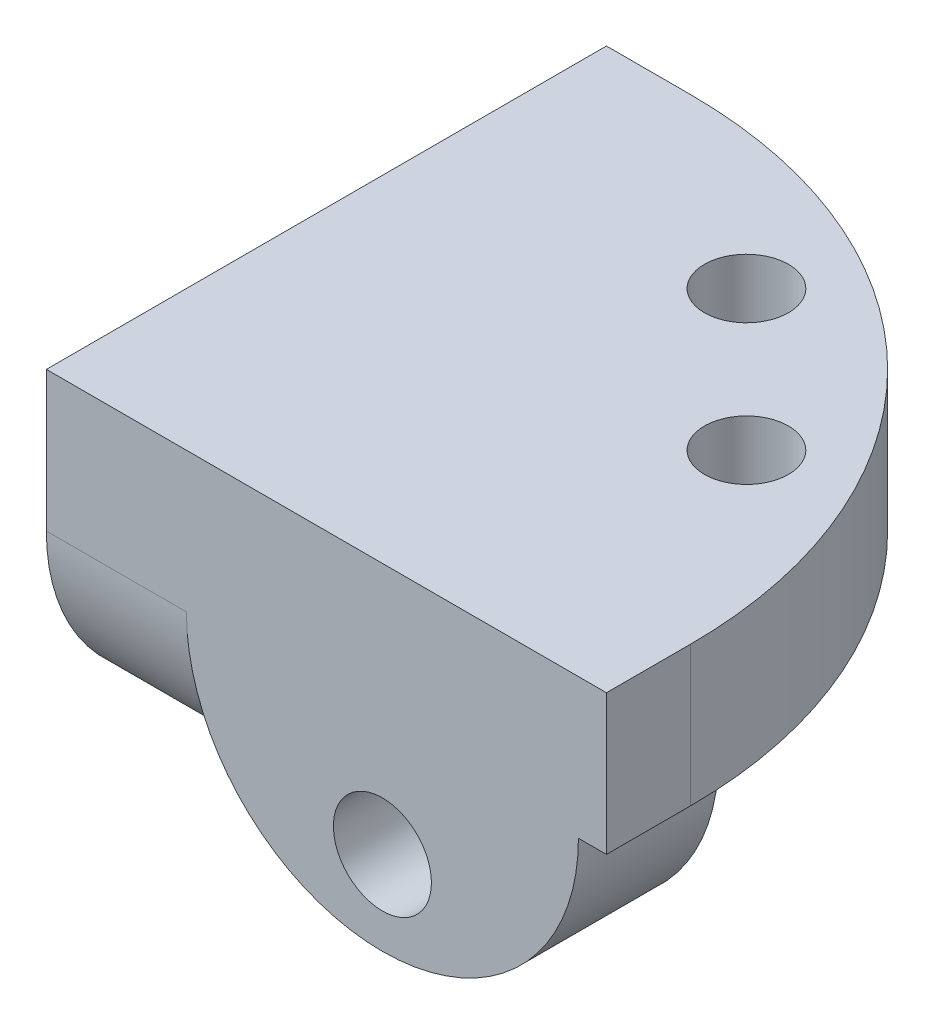
ISO-10303-21;
HEADER;
FILE_DESCRIPTION(('STEP AP214'),'2;1');
FILE_NAME('part.step','',(''),(''),'','','');
FILE_SCHEMA(('AUTOMOTIVE_DESIGN { 1 0 10303 214 1 1 1 1 }'));
ENDSEC;
DATA;
#1=APPLICATION_CONTEXT('core data for automotive mechanical design processes');
#2=APPLICATION_PROTOCOL_DEFINITION('international standard','automotive_design',2000,#1);
#3=PRODUCT_CONTEXT('',#1,'mechanical');
#4=PRODUCT('Part','Part','',(#3));
#5=PRODUCT_RELATED_PRODUCT_CATEGORY('part','',(#4));
#6=PRODUCT_DEFINITION_FORMATION('','',#4);
#7=PRODUCT_DEFINITION_CONTEXT('part definition',#1,'design');
#8=PRODUCT_DEFINITION('design','',#6,#7);
#9=PRODUCT_DEFINITION_SHAPE('','',#8);
#10=(LENGTH_UNIT() NAMED_UNIT(*) SI_UNIT(.MILLI.,.METRE.));
#11=(NAMED_UNIT(*) PLANE_ANGLE_UNIT() SI_UNIT($,.RADIAN.));
#12=(NAMED_UNIT(*) SI_UNIT($,.STERADIAN.) SOLID_ANGLE_UNIT());
#13=UNCERTAINTY_MEASURE_WITH_UNIT(LENGTH_MEASURE(1.E-05),#10,'distance_accuracy_value','');
#14=(GEOMETRIC_REPRESENTATION_CONTEXT(3) GLOBAL_UNCERTAINTY_ASSIGNED_CONTEXT((#13)) GLOBAL_UNIT_ASSIGNED_CONTEXT((#10,
#11,#12)) REPRESENTATION_CONTEXT('',''));
#15=CARTESIAN_POINT('',(0.,0.,0.));
#16=DIRECTION('',(0.,0.,1.));
#17=DIRECTION('',(1.,0.,0.));
#18=AXIS2_PLACEMENT_3D('',#15,#16,#17);
#19=CARTESIAN_POINT('',(0.,5.,0.));
#20=DIRECTION('',(0.,-1.,0.));
#21=DIRECTION('',(0.,0.,-1.));
#22=AXIS2_PLACEMENT_3D('',#19,#20,#21);
#23=PLANE('',#22);
#24=DIRECTION('',(0.,0.,-1.));
#25=VECTOR('',#24,1.);
#26=CARTESIAN_POINT('',(20.,5.,0.));
#27=LINE('',#26,#25);
#28=CARTESIAN_POINT('',(20.,5.,0.));
#29=VERTEX_POINT('',#28);
#30=CARTESIAN_POINT('',(20.,5.,-3.));
#31=VERTEX_POINT('',#30);
#32=EDGE_CURVE('E159',#29,#31,#27,.T.);
#33=ORIENTED_EDGE('',*,*,#32,.T.);
#34=CARTESIAN_POINT('',(3.,5.,-3.));
#35=DIRECTION('',(0.,-1.,0.));
#36=DIRECTION('',(0.,0.,-1.));
#37=AXIS2_PLACEMENT_3D('',#34,#35,#36);
#38=CIRCLE('',#37,17.);
#39=CARTESIAN_POINT('',(3.,5.,-20.));
#40=VERTEX_POINT('',#39);
#41=EDGE_CURVE('E11',#31,#40,#38,.F.);
#42=ORIENTED_EDGE('',*,*,#41,.T.);
#43=DIRECTION('',(-1.,0.,0.));
#44=VECTOR('',#43,1.);
#45=CARTESIAN_POINT('',(0.,5.,-20.));
#46=LINE('',#45,#44);
#47=CARTESIAN_POINT('',(0.,5.,-20.));
#48=VERTEX_POINT('',#47);
#49=EDGE_CURVE('E161',#40,#48,#46,.T.);
#50=ORIENTED_EDGE('',*,*,#49,.T.);
#51=DIRECTION('',(0.,0.,1.));
#52=VECTOR('',#51,1.);
#53=CARTESIAN_POINT('',(0.,5.,0.));
#54=LINE('',#53,#52);
#55=CARTESIAN_POINT('',(0.,5.,0.));
#56=VERTEX_POINT('',#55);
#57=EDGE_CURVE('E153',#48,#56,#54,.T.);
#58=ORIENTED_EDGE('',*,*,#57,.T.);
#59=DIRECTION('',(1.,0.,0.));
#60=VECTOR('',#59,1.);
#61=CARTESIAN_POINT('',(0.,5.,0.));
#62=LINE('',#61,#60);
#63=EDGE_CURVE('E156',#56,#29,#62,.T.);
#64=ORIENTED_EDGE('',*,*,#63,.T.);
#65=EDGE_LOOP('',(#33,#42,#50,#58,#64));
#66=FACE_BOUND('',#65,.T.);
#67=CARTESIAN_POINT('',(10.,5.,-15.));
#68=DIRECTION('',(0.,1.,0.));
#69=DIRECTION('',(0.,0.,1.));
#70=AXIS2_PLACEMENT_3D('',#67,#68,#69);
#71=CIRCLE('',#70,1.5);
#72=CARTESIAN_POINT('',(10.,5.,-13.5));
#73=VERTEX_POINT('',#72);
#74=EDGE_CURVE('E147',#73,#73,#71,.T.);
#75=ORIENTED_EDGE('',*,*,#74,.F.);
#76=EDGE_LOOP('',(#75));
#77=FACE_BOUND('',#76,.T.);
#78=CARTESIAN_POINT('',(15.,5.,-10.));
#79=DIRECTION('',(0.,1.,0.));
#80=DIRECTION('',(0.,0.,1.));
#81=AXIS2_PLACEMENT_3D('',#78,#79,#80);
#82=CIRCLE('',#81,1.5);
#83=CARTESIAN_POINT('',(15.,5.,-8.5));
#84=VERTEX_POINT('',#83);
#85=EDGE_CURVE('E138',#84,#84,#82,.T.);
#86=ORIENTED_EDGE('',*,*,#85,.F.);
#87=EDGE_LOOP('',(#86));
#88=FACE_BOUND('',#87,.T.);
#89=ADVANCED_FACE('F34',(#66,#77,#88),#23,.F.);
#90=CARTESIAN_POINT('',(0.,0.,0.));
#91=DIRECTION('',(0.,-1.,0.));
#92=DIRECTION('',(0.,0.,-1.));
#93=AXIS2_PLACEMENT_3D('',#90,#91,#92);
#94=PLANE('',#93);
#95=DIRECTION('',(-1.,0.,0.));
#96=VECTOR('',#95,1.);
#97=CARTESIAN_POINT('',(0.,0.,-20.));
#98=LINE('',#97,#96);
#99=CARTESIAN_POINT('',(3.,0.,-20.));
#100=VERTEX_POINT('',#99);
#101=CARTESIAN_POINT('',(0.,0.,-20.));
#102=VERTEX_POINT('',#101);
#103=EDGE_CURVE('E157',#100,#102,#98,.T.);
#104=ORIENTED_EDGE('',*,*,#103,.F.);
#105=CARTESIAN_POINT('',(3.,0.,-3.));
#106=DIRECTION('',(0.,-1.,0.));
#107=DIRECTION('',(0.,0.,-1.));
#108=AXIS2_PLACEMENT_3D('',#105,#106,#107);
#109=CIRCLE('',#108,17.);
#110=CARTESIAN_POINT('',(20.,0.,-3.));
#111=VERTEX_POINT('',#110);
#112=EDGE_CURVE('E56',#100,#111,#109,.T.);
#113=ORIENTED_EDGE('',*,*,#112,.T.);
#114=DIRECTION('',(0.,0.,-1.));
#115=VECTOR('',#114,1.);
#116=CARTESIAN_POINT('',(20.,0.,0.));
#117=LINE('',#116,#115);
#118=CARTESIAN_POINT('',(20.,0.,0.));
#119=VERTEX_POINT('',#118);
#120=EDGE_CURVE('E110',#119,#111,#117,.T.);
#121=ORIENTED_EDGE('',*,*,#120,.F.);
#122=DIRECTION('',(1.,0.,0.));
#123=VECTOR('',#122,1.);
#124=CARTESIAN_POINT('',(0.,0.,0.));
#125=LINE('',#124,#123);
#126=CARTESIAN_POINT('',(19.,0.,0.));
#127=VERTEX_POINT('',#126);
#128=EDGE_CURVE('E111',#127,#119,#125,.T.);
#129=ORIENTED_EDGE('',*,*,#128,.F.);
#130=DIRECTION('',(0.,0.,1.));
#131=VECTOR('',#130,1.);
#132=CARTESIAN_POINT('',(19.,0.,-5.));
#133=LINE('',#132,#131);
#134=CARTESIAN_POINT('',(19.,0.,-5.));
#135=VERTEX_POINT('',#134);
#136=EDGE_CURVE('E119',#135,#127,#133,.T.);
#137=ORIENTED_EDGE('',*,*,#136,.F.);
#138=DIRECTION('',(-1.,0.,0.));
#139=VECTOR('',#138,1.);
#140=CARTESIAN_POINT('',(19.,0.,-5.));
#141=LINE('',#140,#139);
#142=CARTESIAN_POINT('',(5.,0.,-5.));
#143=VERTEX_POINT('',#142);
#144=EDGE_CURVE('E140',#135,#143,#141,.T.);
#145=ORIENTED_EDGE('',*,*,#144,.T.);
#146=DIRECTION('',(0.,0.,-1.));
#147=VECTOR('',#146,1.);
#148=CARTESIAN_POINT('',(5.,0.,0.));
#149=LINE('',#148,#147);
#150=CARTESIAN_POINT('',(5.,0.,-14.));
#151=VERTEX_POINT('',#150);
#152=EDGE_CURVE('E131',#143,#151,#149,.T.);
#153=ORIENTED_EDGE('',*,*,#152,.T.);
#154=DIRECTION('',(-1.,0.,0.));
#155=VECTOR('',#154,1.);
#156=CARTESIAN_POINT('',(5.,0.,-14.));
#157=LINE('',#156,#155);
#158=CARTESIAN_POINT('',(0.,0.,-14.));
#159=VERTEX_POINT('',#158);
#160=EDGE_CURVE('E128',#151,#159,#157,.T.);
#161=ORIENTED_EDGE('',*,*,#160,.T.);
#162=DIRECTION('',(0.,0.,1.));
#163=VECTOR('',#162,1.);
#164=CARTESIAN_POINT('',(0.,0.,0.));
#165=LINE('',#164,#163);
#166=EDGE_CURVE('E150',#102,#159,#165,.T.);
#167=ORIENTED_EDGE('',*,*,#166,.F.);
#168=EDGE_LOOP('',(#104,#113,#121,#129,#137,#145,#153,#161,#167));
#169=FACE_BOUND('',#168,.T.);
#170=CARTESIAN_POINT('',(10.,0.,-15.));
#171=DIRECTION('',(0.,1.,0.));
#172=DIRECTION('',(0.,0.,1.));
#173=AXIS2_PLACEMENT_3D('',#170,#171,#172);
#174=CIRCLE('',#173,1.5);
#175=CARTESIAN_POINT('',(10.,0.,-13.5));
#176=VERTEX_POINT('',#175);
#177=EDGE_CURVE('E145',#176,#176,#174,.T.);
#178=ORIENTED_EDGE('',*,*,#177,.T.);
#179=EDGE_LOOP('',(#178));
#180=FACE_BOUND('',#179,.T.);
#181=CARTESIAN_POINT('',(15.,0.,-10.));
#182=DIRECTION('',(0.,1.,0.));
#183=DIRECTION('',(0.,0.,1.));
#184=AXIS2_PLACEMENT_3D('',#181,#182,#183);
#185=CIRCLE('',#184,1.5);
#186=CARTESIAN_POINT('',(15.,0.,-8.5));
#187=VERTEX_POINT('',#186);
#188=EDGE_CURVE('E135',#187,#187,#185,.T.);
#189=ORIENTED_EDGE('',*,*,#188,.T.);
#190=EDGE_LOOP('',(#189));
#191=FACE_BOUND('',#190,.T.);
#192=ADVANCED_FACE('F185',(#169,#180,#191),#94,.T.);
#193=CARTESIAN_POINT('',(0.,5.,0.));
#194=DIRECTION('',(1.,0.,0.));
#195=DIRECTION('',(0.,0.,-1.));
#196=AXIS2_PLACEMENT_3D('',#193,#194,#195);
#197=PLANE('',#196);
#198=ORIENTED_EDGE('',*,*,#166,.T.);
#199=CARTESIAN_POINT('',(0.,0.,-7.));
#200=DIRECTION('',(-1.,0.,0.));
#201=DIRECTION('',(0.,0.,-1.));
#202=AXIS2_PLACEMENT_3D('',#199,#200,#201);
#203=CIRCLE('',#202,7.);
#204=CARTESIAN_POINT('',(0.,0.,0.));
#205=VERTEX_POINT('',#204);
#206=EDGE_CURVE('E132',#159,#205,#203,.T.);
#207=ORIENTED_EDGE('',*,*,#206,.T.);
#208=DIRECTION('',(0.,-1.,0.));
#209=VECTOR('',#208,1.);
#210=CARTESIAN_POINT('',(0.,5.,0.));
#211=LINE('',#210,#209);
#212=EDGE_CURVE('E105',#56,#205,#211,.T.);
#213=ORIENTED_EDGE('',*,*,#212,.F.);
#214=ORIENTED_EDGE('',*,*,#57,.F.);
#215=DIRECTION('',(0.,-1.,0.));
#216=VECTOR('',#215,1.);
#217=CARTESIAN_POINT('',(0.,5.,-20.));
#218=LINE('',#217,#216);
#219=EDGE_CURVE('E163',#48,#102,#218,.T.);
#220=ORIENTED_EDGE('',*,*,#219,.T.);
#221=EDGE_LOOP('',(#198,#207,#213,#214,#220));
#222=FACE_BOUND('',#221,.T.);
#223=CARTESIAN_POINT('',(0.,-4.,-7.));
#224=DIRECTION('',(-1.,0.,0.));
#225=DIRECTION('',(0.,0.,1.));
#226=AXIS2_PLACEMENT_3D('',#223,#224,#225);
#227=CIRCLE('',#226,1.75);
#228=CARTESIAN_POINT('',(0.,-4.,-5.25));
#229=VERTEX_POINT('',#228);
#230=EDGE_CURVE('E194',#229,#229,#227,.T.);
#231=ORIENTED_EDGE('',*,*,#230,.F.);
#232=EDGE_LOOP('',(#231));
#233=FACE_BOUND('',#232,.T.);
#234=ADVANCED_FACE('F188',(#222,#233),#197,.F.);
#235=CARTESIAN_POINT('',(0.,5.,0.));
#236=DIRECTION('',(0.,0.,-1.));
#237=DIRECTION('',(-1.,0.,0.));
#238=AXIS2_PLACEMENT_3D('',#235,#236,#237);
#239=PLANE('',#238);
#240=CARTESIAN_POINT('',(5.,0.,0.));
#241=VERTEX_POINT('',#240);
#242=EDGE_CURVE('E98',#205,#241,#125,.T.);
#243=ORIENTED_EDGE('',*,*,#242,.T.);
#244=CARTESIAN_POINT('',(12.,0.,0.));
#245=DIRECTION('',(0.,0.,1.));
#246=DIRECTION('',(1.,0.,0.));
#247=AXIS2_PLACEMENT_3D('',#244,#245,#246);
#248=CIRCLE('',#247,7.);
#249=EDGE_CURVE('E102',#241,#127,#248,.T.);
#250=ORIENTED_EDGE('',*,*,#249,.T.);
#251=ORIENTED_EDGE('',*,*,#128,.T.);
#252=DIRECTION('',(0.,-1.,0.));
#253=VECTOR('',#252,1.);
#254=CARTESIAN_POINT('',(20.,5.,0.));
#255=LINE('',#254,#253);
#256=EDGE_CURVE('E170',#29,#119,#255,.T.);
#257=ORIENTED_EDGE('',*,*,#256,.F.);
#258=ORIENTED_EDGE('',*,*,#63,.F.);
#259=ORIENTED_EDGE('',*,*,#212,.T.);
#260=EDGE_LOOP('',(#243,#250,#251,#257,#258,#259));
#261=FACE_BOUND('',#260,.T.);
#262=CARTESIAN_POINT('',(12.,-4.,0.));
#263=DIRECTION('',(0.,0.,1.));
#264=DIRECTION('',(1.,0.,0.));
#265=AXIS2_PLACEMENT_3D('',#262,#263,#264);
#266=CIRCLE('',#265,1.75);
#267=CARTESIAN_POINT('',(13.75,-4.,0.));
#268=VERTEX_POINT('',#267);
#269=EDGE_CURVE('E199',#268,#268,#266,.T.);
#270=ORIENTED_EDGE('',*,*,#269,.F.);
#271=EDGE_LOOP('',(#270));
#272=FACE_BOUND('',#271,.T.);
#273=ADVANCED_FACE('F100',(#261,#272),#239,.F.);
#274=CARTESIAN_POINT('',(20.,5.,0.));
#275=DIRECTION('',(-1.,0.,0.));
#276=DIRECTION('',(0.,0.,1.));
#277=AXIS2_PLACEMENT_3D('',#274,#275,#276);
#278=PLANE('',#277);
#279=ORIENTED_EDGE('',*,*,#120,.T.);
#280=DIRECTION('',(0.,-1.,0.));
#281=VECTOR('',#280,1.);
#282=CARTESIAN_POINT('',(20.,5.,-3.));
#283=LINE('',#282,#281);
#284=EDGE_CURVE('E42',#111,#31,#283,.F.);
#285=ORIENTED_EDGE('',*,*,#284,.T.);
#286=ORIENTED_EDGE('',*,*,#32,.F.);
#287=ORIENTED_EDGE('',*,*,#256,.T.);
#288=EDGE_LOOP('',(#279,#285,#286,#287));
#289=FACE_BOUND('',#288,.T.);
#290=ADVANCED_FACE('F234',(#289),#278,.F.);
#291=CARTESIAN_POINT('',(0.,5.,-20.));
#292=DIRECTION('',(0.,0.,1.));
#293=DIRECTION('',(1.,0.,0.));
#294=AXIS2_PLACEMENT_3D('',#291,#292,#293);
#295=PLANE('',#294);
#296=ORIENTED_EDGE('',*,*,#49,.F.);
#297=DIRECTION('',(0.,-1.,0.));
#298=VECTOR('',#297,1.);
#299=CARTESIAN_POINT('',(3.,5.,-20.));
#300=LINE('',#299,#298);
#301=EDGE_CURVE('E174',#40,#100,#300,.T.);
#302=ORIENTED_EDGE('',*,*,#301,.T.);
#303=ORIENTED_EDGE('',*,*,#103,.T.);
#304=ORIENTED_EDGE('',*,*,#219,.F.);
#305=EDGE_LOOP('',(#296,#302,#303,#304));
#306=FACE_BOUND('',#305,.T.);
#307=ADVANCED_FACE('F180',(#306),#295,.F.);
#308=CARTESIAN_POINT('',(10.,5.,-15.));
#309=DIRECTION('',(0.,-1.,0.));
#310=DIRECTION('',(0.,0.,-1.));
#311=AXIS2_PLACEMENT_3D('',#308,#309,#310);
#312=CYLINDRICAL_SURFACE('',#311,1.5);
#313=ORIENTED_EDGE('',*,*,#74,.T.);
#314=EDGE_LOOP('',(#313));
#315=FACE_BOUND('',#314,.T.);
#316=ORIENTED_EDGE('',*,*,#177,.F.);
#317=EDGE_LOOP('',(#316));
#318=FACE_BOUND('',#317,.T.);
#319=ADVANCED_FACE('F229',(#315,#318),#312,.F.);
#320=CARTESIAN_POINT('',(15.,5.,-10.));
#321=DIRECTION('',(0.,-1.,0.));
#322=DIRECTION('',(0.,0.,-1.));
#323=AXIS2_PLACEMENT_3D('',#320,#321,#322);
#324=CYLINDRICAL_SURFACE('',#323,1.5);
#325=ORIENTED_EDGE('',*,*,#85,.T.);
#326=EDGE_LOOP('',(#325));
#327=FACE_BOUND('',#326,.T.);
#328=ORIENTED_EDGE('',*,*,#188,.F.);
#329=EDGE_LOOP('',(#328));
#330=FACE_BOUND('',#329,.T.);
#331=ADVANCED_FACE('F218',(#327,#330),#324,.F.);
#332=CARTESIAN_POINT('',(12.,0.,-5.));
#333=DIRECTION('',(0.,0.,1.));
#334=DIRECTION('',(1.,0.,0.));
#335=AXIS2_PLACEMENT_3D('',#332,#333,#334);
#336=CYLINDRICAL_SURFACE('',#335,7.);
#337=ORIENTED_EDGE('',*,*,#249,.F.);
#338=DIRECTION('',(0.,0.,1.));
#339=VECTOR('',#338,1.);
#340=CARTESIAN_POINT('',(5.,0.,-5.));
#341=LINE('',#340,#339);
#342=EDGE_CURVE('E116',#143,#241,#341,.T.);
#343=ORIENTED_EDGE('',*,*,#342,.F.);
#344=CARTESIAN_POINT('',(12.,0.,-5.));
#345=DIRECTION('',(0.,0.,1.));
#346=DIRECTION('',(1.,0.,0.));
#347=AXIS2_PLACEMENT_3D('',#344,#345,#346);
#348=CIRCLE('',#347,7.);
#349=EDGE_CURVE('E121',#143,#135,#348,.T.);
#350=ORIENTED_EDGE('',*,*,#349,.T.);
#351=ORIENTED_EDGE('',*,*,#136,.T.);
#352=EDGE_LOOP('',(#337,#343,#350,#351));
#353=FACE_BOUND('',#352,.T.);
#354=ADVANCED_FACE('F114',(#353),#336,.T.);
#355=CARTESIAN_POINT('',(12.,0.,-5.));
#356=DIRECTION('',(0.,0.,1.));
#357=DIRECTION('',(1.,0.,0.));
#358=AXIS2_PLACEMENT_3D('',#355,#356,#357);
#359=PLANE('',#358);
#360=CARTESIAN_POINT('',(12.,-4.,-5.));
#361=DIRECTION('',(0.,0.,1.));
#362=DIRECTION('',(1.,0.,0.));
#363=AXIS2_PLACEMENT_3D('',#360,#361,#362);
#364=CIRCLE('',#363,1.75);
#365=CARTESIAN_POINT('',(13.75,-4.,-5.));
#366=VERTEX_POINT('',#365);
#367=EDGE_CURVE('E122',#366,#366,#364,.T.);
#368=ORIENTED_EDGE('',*,*,#367,.T.);
#369=EDGE_LOOP('',(#368));
#370=FACE_BOUND('',#369,.T.);
#371=ORIENTED_EDGE('',*,*,#349,.F.);
#372=ORIENTED_EDGE('',*,*,#144,.F.);
#373=EDGE_LOOP('',(#371,#372));
#374=FACE_BOUND('',#373,.T.);
#375=ADVANCED_FACE('F207',(#370,#374),#359,.F.);
#376=CARTESIAN_POINT('',(12.,-4.,-5.));
#377=DIRECTION('',(0.,0.,1.));
#378=DIRECTION('',(1.,0.,0.));
#379=AXIS2_PLACEMENT_3D('',#376,#377,#378);
#380=CYLINDRICAL_SURFACE('',#379,1.75);
#381=ORIENTED_EDGE('',*,*,#367,.F.);
#382=EDGE_LOOP('',(#381));
#383=FACE_BOUND('',#382,.T.);
#384=ORIENTED_EDGE('',*,*,#269,.T.);
#385=EDGE_LOOP('',(#384));
#386=FACE_BOUND('',#385,.T.);
#387=ADVANCED_FACE('F209',(#383,#386),#380,.F.);
#388=CARTESIAN_POINT('',(5.,0.,-7.));
#389=DIRECTION('',(-1.,0.,0.));
#390=DIRECTION('',(0.,0.,1.));
#391=AXIS2_PLACEMENT_3D('',#388,#389,#390);
#392=CYLINDRICAL_SURFACE('',#391,7.);
#393=ORIENTED_EDGE('',*,*,#206,.F.);
#394=ORIENTED_EDGE('',*,*,#160,.F.);
#395=CARTESIAN_POINT('',(5.,0.,-7.));
#396=DIRECTION('',(-1.,0.,0.));
#397=DIRECTION('',(0.,0.,-1.));
#398=AXIS2_PLACEMENT_3D('',#395,#396,#397);
#399=CIRCLE('',#398,7.);
#400=EDGE_CURVE('E126',#151,#241,#399,.T.);
#401=ORIENTED_EDGE('',*,*,#400,.T.);
#402=ORIENTED_EDGE('',*,*,#242,.F.);
#403=EDGE_LOOP('',(#393,#394,#401,#402));
#404=FACE_BOUND('',#403,.T.);
#405=ADVANCED_FACE('F127',(#404),#392,.T.);
#406=CARTESIAN_POINT('',(5.,0.,-7.));
#407=DIRECTION('',(1.,0.,0.));
#408=DIRECTION('',(0.,0.,-1.));
#409=AXIS2_PLACEMENT_3D('',#406,#407,#408);
#410=PLANE('',#409);
#411=CARTESIAN_POINT('',(5.,-4.,-7.));
#412=DIRECTION('',(-1.,0.,0.));
#413=DIRECTION('',(0.,0.,1.));
#414=AXIS2_PLACEMENT_3D('',#411,#412,#413);
#415=CIRCLE('',#414,1.75);
#416=CARTESIAN_POINT('',(5.,-4.,-5.25));
#417=VERTEX_POINT('',#416);
#418=EDGE_CURVE('E191',#417,#417,#415,.T.);
#419=ORIENTED_EDGE('',*,*,#418,.T.);
#420=EDGE_LOOP('',(#419));
#421=FACE_BOUND('',#420,.T.);
#422=ORIENTED_EDGE('',*,*,#400,.F.);
#423=ORIENTED_EDGE('',*,*,#152,.F.);
#424=ORIENTED_EDGE('',*,*,#342,.T.);
#425=EDGE_LOOP('',(#422,#423,#424));
#426=FACE_BOUND('',#425,.T.);
#427=ADVANCED_FACE('F134',(#421,#426),#410,.T.);
#428=CARTESIAN_POINT('',(5.,-4.,-7.));
#429=DIRECTION('',(-1.,0.,0.));
#430=DIRECTION('',(0.,0.,1.));
#431=AXIS2_PLACEMENT_3D('',#428,#429,#430);
#432=CYLINDRICAL_SURFACE('',#431,1.75);
#433=ORIENTED_EDGE('',*,*,#418,.F.);
#434=EDGE_LOOP('',(#433));
#435=FACE_BOUND('',#434,.T.);
#436=ORIENTED_EDGE('',*,*,#230,.T.);
#437=EDGE_LOOP('',(#436));
#438=FACE_BOUND('',#437,.T.);
#439=ADVANCED_FACE('F310',(#435,#438),#432,.F.);
#440=CARTESIAN_POINT('',(3.,5.,-3.));
#441=DIRECTION('',(0.,-1.,0.));
#442=DIRECTION('',(0.,0.,-1.));
#443=AXIS2_PLACEMENT_3D('',#440,#441,#442);
#444=CYLINDRICAL_SURFACE('',#443,17.);
#445=ORIENTED_EDGE('',*,*,#41,.F.);
#446=ORIENTED_EDGE('',*,*,#284,.F.);
#447=ORIENTED_EDGE('',*,*,#112,.F.);
#448=ORIENTED_EDGE('',*,*,#301,.F.);
#449=EDGE_LOOP('',(#445,#446,#447,#448));
#450=FACE_BOUND('',#449,.T.);
#451=ADVANCED_FACE('F36',(#450),#444,.T.);
#452=CLOSED_SHELL('',(#89,#192,#234,#273,#290,#307,#319,#331,#354,#375,#387,#405,#427,#439,#451));
#453=MANIFOLD_SOLID_BREP('B2',#452);
#454=ADVANCED_BREP_SHAPE_REPRESENTATION('',(#18,#453),#14);
#455=SHAPE_DEFINITION_REPRESENTATION(#9,#454);
ENDSEC;
END-ISO-10303-21;
